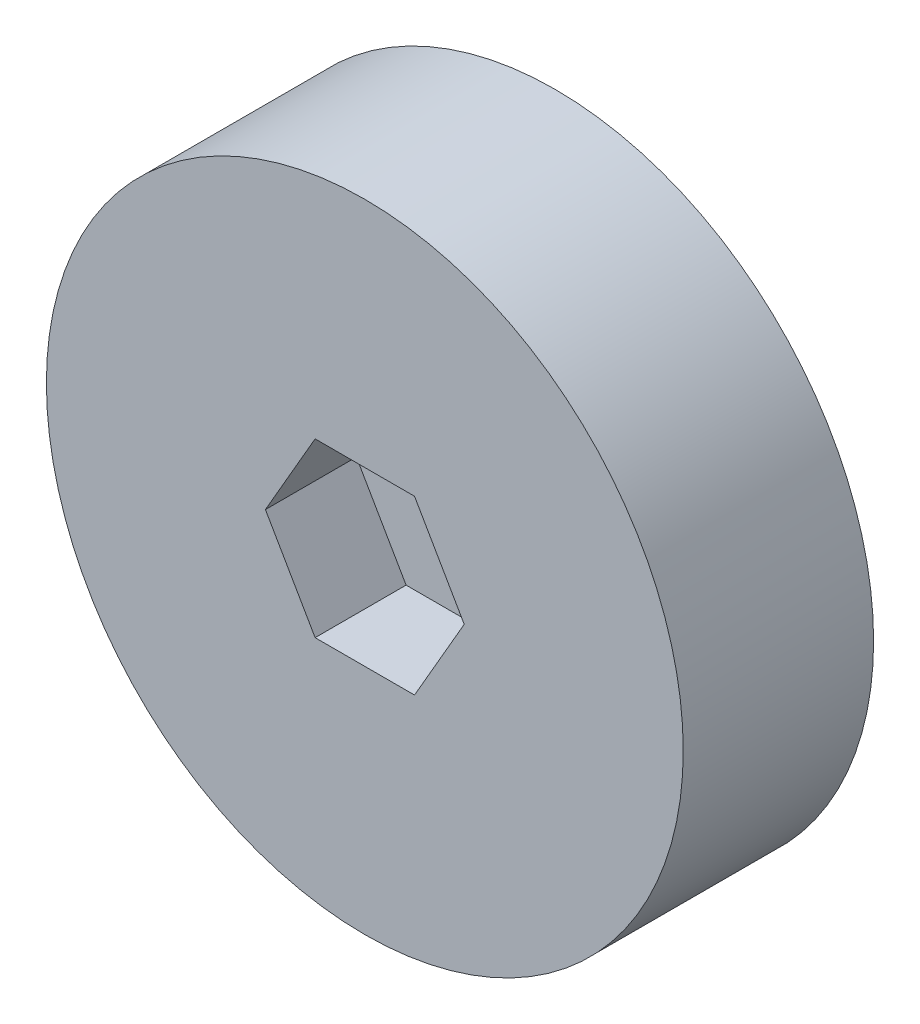
ISO-10303-21;
HEADER;
FILE_DESCRIPTION(('STEP AP214'),'2;1');
FILE_NAME('part.step','',(''),(''),'','','');
FILE_SCHEMA(('AUTOMOTIVE_DESIGN { 1 0 10303 214 1 1 1 1 }'));
ENDSEC;
DATA;
#1=APPLICATION_CONTEXT('core data for automotive mechanical design processes');
#2=APPLICATION_PROTOCOL_DEFINITION('international standard','automotive_design',2000,#1);
#3=PRODUCT_CONTEXT('',#1,'mechanical');
#4=PRODUCT('Part','Part','',(#3));
#5=PRODUCT_RELATED_PRODUCT_CATEGORY('part','',(#4));
#6=PRODUCT_DEFINITION_FORMATION('','',#4);
#7=PRODUCT_DEFINITION_CONTEXT('part definition',#1,'design');
#8=PRODUCT_DEFINITION('design','',#6,#7);
#9=PRODUCT_DEFINITION_SHAPE('','',#8);
#10=(LENGTH_UNIT() NAMED_UNIT(*) SI_UNIT(.MILLI.,.METRE.));
#11=(NAMED_UNIT(*) PLANE_ANGLE_UNIT() SI_UNIT($,.RADIAN.));
#12=(NAMED_UNIT(*) SI_UNIT($,.STERADIAN.) SOLID_ANGLE_UNIT());
#13=UNCERTAINTY_MEASURE_WITH_UNIT(LENGTH_MEASURE(1.E-05),#10,'distance_accuracy_value','');
#14=(GEOMETRIC_REPRESENTATION_CONTEXT(3) GLOBAL_UNCERTAINTY_ASSIGNED_CONTEXT((#13)) GLOBAL_UNIT_ASSIGNED_CONTEXT((#10,
#11,#12)) REPRESENTATION_CONTEXT('',''));
#15=CARTESIAN_POINT('',(0.,0.,0.));
#16=DIRECTION('',(0.,0.,1.));
#17=DIRECTION('',(1.,0.,0.));
#18=AXIS2_PLACEMENT_3D('',#15,#16,#17);
#19=CARTESIAN_POINT('',(0.,0.,-7.1));
#20=DIRECTION('',(0.,0.,-1.));
#21=DIRECTION('',(-1.,0.,0.));
#22=AXIS2_PLACEMENT_3D('',#19,#20,#21);
#23=PLANE('',#22);
#24=CARTESIAN_POINT('',(0.,0.,-7.1));
#25=DIRECTION('',(0.,0.,-1.));
#26=DIRECTION('',(-1.,0.,0.));
#27=AXIS2_PLACEMENT_3D('',#24,#25,#26);
#28=CIRCLE('',#27,22.75);
#29=CARTESIAN_POINT('',(-22.75,0.,-7.1));
#30=VERTEX_POINT('',#29);
#31=EDGE_CURVE('E132',#30,#30,#28,.T.);
#32=ORIENTED_EDGE('',*,*,#31,.T.);
#33=EDGE_LOOP('',(#32));
#34=FACE_BOUND('',#33,.T.);
#35=CARTESIAN_POINT('',(0.,0.,-7.1));
#36=DIRECTION('',(0.,0.,-1.));
#37=DIRECTION('',(-1.,0.,0.));
#38=AXIS2_PLACEMENT_3D('',#35,#36,#37);
#39=CIRCLE('',#38,4.);
#40=CARTESIAN_POINT('',(-4.,0.,-7.1));
#41=VERTEX_POINT('',#40);
#42=EDGE_CURVE('E161',#41,#41,#39,.T.);
#43=ORIENTED_EDGE('',*,*,#42,.F.);
#44=EDGE_LOOP('',(#43));
#45=FACE_BOUND('',#44,.T.);
#46=ADVANCED_FACE('F39',(#34,#45),#23,.T.);
#47=CARTESIAN_POINT('',(0.,0.,6.5));
#48=DIRECTION('',(0.,0.,1.));
#49=DIRECTION('',(1.,0.,0.));
#50=AXIS2_PLACEMENT_3D('',#47,#48,#49);
#51=PLANE('',#50);
#52=CARTESIAN_POINT('',(0.,0.,6.5));
#53=DIRECTION('',(0.,0.,1.));
#54=DIRECTION('',(1.,0.,0.));
#55=AXIS2_PLACEMENT_3D('',#52,#53,#54);
#56=CIRCLE('',#55,22.75);
#57=CARTESIAN_POINT('',(-22.75,0.,6.5));
#58=VERTEX_POINT('',#57);
#59=EDGE_CURVE('E11',#58,#58,#56,.T.);
#60=ORIENTED_EDGE('',*,*,#59,.T.);
#61=EDGE_LOOP('',(#60));
#62=FACE_BOUND('',#61,.T.);
#63=DIRECTION('',(-0.5,0.866025403784439,0.));
#64=VECTOR('',#63,1.);
#65=CARTESIAN_POINT('',(7.1014083110324,0.,6.5));
#66=LINE('',#65,#64);
#67=CARTESIAN_POINT('',(7.1014083110324,0.,6.5));
#68=VERTEX_POINT('',#67);
#69=CARTESIAN_POINT('',(3.5507041555162,6.15,6.5));
#70=VERTEX_POINT('',#69);
#71=EDGE_CURVE('E109',#68,#70,#66,.T.);
#72=ORIENTED_EDGE('',*,*,#71,.F.);
#73=DIRECTION('',(0.5,0.866025403784439,0.));
#74=VECTOR('',#73,1.);
#75=CARTESIAN_POINT('',(3.5507041555162,-6.15,6.5));
#76=LINE('',#75,#74);
#77=CARTESIAN_POINT('',(3.5507041555162,-6.15,6.5));
#78=VERTEX_POINT('',#77);
#79=EDGE_CURVE('E89',#78,#68,#76,.T.);
#80=ORIENTED_EDGE('',*,*,#79,.F.);
#81=DIRECTION('',(1.,0.,0.));
#82=VECTOR('',#81,1.);
#83=CARTESIAN_POINT('',(-3.5507041555162,-6.15,6.5));
#84=LINE('',#83,#82);
#85=CARTESIAN_POINT('',(-3.5507041555162,-6.15,6.5));
#86=VERTEX_POINT('',#85);
#87=EDGE_CURVE('E60',#86,#78,#84,.T.);
#88=ORIENTED_EDGE('',*,*,#87,.F.);
#89=DIRECTION('',(0.5,-0.866025403784439,0.));
#90=VECTOR('',#89,1.);
#91=CARTESIAN_POINT('',(-7.1014083110324,0.,6.5));
#92=LINE('',#91,#90);
#93=CARTESIAN_POINT('',(-7.1014083110324,0.,6.5));
#94=VERTEX_POINT('',#93);
#95=EDGE_CURVE('E121',#94,#86,#92,.T.);
#96=ORIENTED_EDGE('',*,*,#95,.F.);
#97=DIRECTION('',(-0.5,-0.866025403784439,0.));
#98=VECTOR('',#97,1.);
#99=CARTESIAN_POINT('',(-3.5507041555162,6.15,6.5));
#100=LINE('',#99,#98);
#101=CARTESIAN_POINT('',(-3.5507041555162,6.15,6.5));
#102=VERTEX_POINT('',#101);
#103=EDGE_CURVE('E108',#102,#94,#100,.T.);
#104=ORIENTED_EDGE('',*,*,#103,.F.);
#105=DIRECTION('',(-1.,0.,0.));
#106=VECTOR('',#105,1.);
#107=CARTESIAN_POINT('',(3.5507041555162,6.15,6.5));
#108=LINE('',#107,#106);
#109=EDGE_CURVE('E98',#70,#102,#108,.T.);
#110=ORIENTED_EDGE('',*,*,#109,.F.);
#111=EDGE_LOOP('',(#72,#80,#88,#96,#104,#110));
#112=FACE_BOUND('',#111,.T.);
#113=ADVANCED_FACE('F120',(#62,#112),#51,.T.);
#114=CARTESIAN_POINT('',(0.,0.,6.5));
#115=DIRECTION('',(0.,0.,-1.));
#116=DIRECTION('',(-1.,0.,0.));
#117=AXIS2_PLACEMENT_3D('',#114,#115,#116);
#118=CYLINDRICAL_SURFACE('',#117,22.75);
#119=CARTESIAN_POINT('',(-22.75,0.,6.5));
#120=CARTESIAN_POINT('',(-22.75,0.,6.35833333333333));
#121=CARTESIAN_POINT('',(-22.75,0.,6.21666666666667));
#122=CARTESIAN_POINT('',(-22.75,0.,5.93333333333333));
#123=CARTESIAN_POINT('',(-22.75,0.,5.79166666666667));
#124=CARTESIAN_POINT('',(-22.75,0.,5.50833333333333));
#125=CARTESIAN_POINT('',(-22.75,0.,5.36666666666667));
#126=CARTESIAN_POINT('',(-22.75,0.,5.08333333333333));
#127=CARTESIAN_POINT('',(-22.75,0.,4.94166666666667));
#128=CARTESIAN_POINT('',(-22.75,0.,4.65833333333333));
#129=CARTESIAN_POINT('',(-22.75,0.,4.51666666666667));
#130=CARTESIAN_POINT('',(-22.75,0.,4.23333333333333));
#131=CARTESIAN_POINT('',(-22.75,0.,4.09166666666667));
#132=CARTESIAN_POINT('',(-22.75,0.,3.80833333333333));
#133=CARTESIAN_POINT('',(-22.75,0.,3.66666666666667));
#134=CARTESIAN_POINT('',(-22.75,0.,3.38333333333333));
#135=CARTESIAN_POINT('',(-22.75,0.,3.24166666666667));
#136=CARTESIAN_POINT('',(-22.75,0.,2.95833333333333));
#137=CARTESIAN_POINT('',(-22.75,0.,2.81666666666667));
#138=CARTESIAN_POINT('',(-22.75,0.,2.53333333333333));
#139=CARTESIAN_POINT('',(-22.75,0.,2.39166666666667));
#140=CARTESIAN_POINT('',(-22.75,0.,2.10833333333333));
#141=CARTESIAN_POINT('',(-22.75,0.,1.96666666666667));
#142=CARTESIAN_POINT('',(-22.75,0.,1.68333333333333));
#143=CARTESIAN_POINT('',(-22.75,0.,1.54166666666667));
#144=CARTESIAN_POINT('',(-22.75,0.,1.25833333333333));
#145=CARTESIAN_POINT('',(-22.75,0.,1.11666666666667));
#146=CARTESIAN_POINT('',(-22.75,0.,0.833333333333333));
#147=CARTESIAN_POINT('',(-22.75,0.,0.691666666666666));
#148=CARTESIAN_POINT('',(-22.75,0.,0.408333333333333));
#149=CARTESIAN_POINT('',(-22.75,0.,0.266666666666666));
#150=CARTESIAN_POINT('',(-22.75,0.,-0.0166666666666674));
#151=CARTESIAN_POINT('',(-22.75,0.,-0.158333333333334));
#152=CARTESIAN_POINT('',(-22.75,0.,-0.441666666666667));
#153=CARTESIAN_POINT('',(-22.75,0.,-0.583333333333334));
#154=CARTESIAN_POINT('',(-22.75,0.,-0.866666666666667));
#155=CARTESIAN_POINT('',(-22.75,0.,-1.00833333333333));
#156=CARTESIAN_POINT('',(-22.75,0.,-1.29166666666667));
#157=CARTESIAN_POINT('',(-22.75,0.,-1.43333333333333));
#158=CARTESIAN_POINT('',(-22.75,0.,-1.71666666666667));
#159=CARTESIAN_POINT('',(-22.75,0.,-1.85833333333333));
#160=CARTESIAN_POINT('',(-22.75,0.,-2.14166666666667));
#161=CARTESIAN_POINT('',(-22.75,0.,-2.28333333333333));
#162=CARTESIAN_POINT('',(-22.75,0.,-2.56666666666667));
#163=CARTESIAN_POINT('',(-22.75,0.,-2.70833333333333));
#164=CARTESIAN_POINT('',(-22.75,0.,-2.99166666666667));
#165=CARTESIAN_POINT('',(-22.75,0.,-3.13333333333333));
#166=CARTESIAN_POINT('',(-22.75,0.,-3.41666666666667));
#167=CARTESIAN_POINT('',(-22.75,0.,-3.55833333333333));
#168=CARTESIAN_POINT('',(-22.75,0.,-3.84166666666667));
#169=CARTESIAN_POINT('',(-22.75,0.,-3.98333333333333));
#170=CARTESIAN_POINT('',(-22.75,0.,-4.26666666666667));
#171=CARTESIAN_POINT('',(-22.75,0.,-4.40833333333333));
#172=CARTESIAN_POINT('',(-22.75,0.,-4.69166666666667));
#173=CARTESIAN_POINT('',(-22.75,0.,-4.83333333333333));
#174=CARTESIAN_POINT('',(-22.75,0.,-5.11666666666667));
#175=CARTESIAN_POINT('',(-22.75,0.,-5.25833333333333));
#176=CARTESIAN_POINT('',(-22.75,0.,-5.54166666666667));
#177=CARTESIAN_POINT('',(-22.75,0.,-5.68333333333333));
#178=CARTESIAN_POINT('',(-22.75,0.,-5.96666666666667));
#179=CARTESIAN_POINT('',(-22.75,0.,-6.10833333333333));
#180=CARTESIAN_POINT('',(-22.75,0.,-6.39166666666667));
#181=CARTESIAN_POINT('',(-22.75,0.,-6.53333333333333));
#182=CARTESIAN_POINT('',(-22.75,0.,-6.81666666666667));
#183=CARTESIAN_POINT('',(-22.75,0.,-6.95833333333333));
#184=CARTESIAN_POINT('',(-22.75,0.,-7.1));
#185=B_SPLINE_CURVE_WITH_KNOTS('',3,(#119,#120,#121,#122,#123,#124,#125,#126,#127,#128,#129,
#130,#131,#132,#133,#134,#135,#136,#137,#138,#139,#140,#141,#142,#143,#144,#145,#146,#147,#148,
#149,#150,#151,#152,#153,#154,#155,#156,#157,#158,#159,#160,#161,#162,#163,#164,#165,#166,#167,
#168,#169,#170,#171,#172,#173,#174,#175,#176,#177,#178,#179,#180,#181,#182,#183,#184),
.UNSPECIFIED.,.F.,.F.,(4,2,2,2,2,2,2,2,2,2,2,2,2,2,2,2,2,2,2,2,2,2,2,2,2,2,2,2,2,2,2,2,4),(0.,
0.424999999999999,0.849999999999999,1.275,1.7,2.125,2.55,2.975,3.4,3.825,4.25,4.675,5.1,5.525,
5.95,6.375,6.8,7.225,7.65,8.075,8.5,8.925,9.35,9.775,10.2,10.625,11.05,11.475,11.9,12.325,12.75,
13.175,13.6),.UNSPECIFIED.);
#186=EDGE_CURVE('BSEAM41',#58,#30,#185,.T.);
#187=ORIENTED_EDGE('',*,*,#59,.F.);
#188=ORIENTED_EDGE('',*,*,#31,.F.);
#189=ORIENTED_EDGE('',*,*,#186,.T.);
#190=ORIENTED_EDGE('',*,*,#186,.F.);
#191=EDGE_LOOP('',(#187,#189,#188,#190));
#192=FACE_BOUND('',#191,.T.);
#193=ADVANCED_FACE('F41',(#192),#118,.T.);
#194=CARTESIAN_POINT('',(3.5507041555162,-6.15,6.5));
#195=DIRECTION('',(-0.866025403784438,0.5,0.));
#196=DIRECTION('',(-0.5,-0.866025403784439,0.));
#197=AXIS2_PLACEMENT_3D('',#194,#195,#196);
#198=PLANE('',#197);
#199=DIRECTION('',(0.5,0.866025403784439,0.));
#200=VECTOR('',#199,1.);
#201=CARTESIAN_POINT('',(3.5507041555162,-6.15,0.));
#202=LINE('',#201,#200);
#203=CARTESIAN_POINT('',(3.5507041555162,-6.15,0.));
#204=VERTEX_POINT('',#203);
#205=CARTESIAN_POINT('',(7.1014083110324,0.,0.));
#206=VERTEX_POINT('',#205);
#207=EDGE_CURVE('E128',#204,#206,#202,.T.);
#208=ORIENTED_EDGE('',*,*,#207,.F.);
#209=DIRECTION('',(0.,0.,-1.));
#210=VECTOR('',#209,1.);
#211=CARTESIAN_POINT('',(3.5507041555162,-6.15,6.5));
#212=LINE('',#211,#210);
#213=EDGE_CURVE('E127',#78,#204,#212,.T.);
#214=ORIENTED_EDGE('',*,*,#213,.F.);
#215=ORIENTED_EDGE('',*,*,#79,.T.);
#216=DIRECTION('',(0.,0.,-1.));
#217=VECTOR('',#216,1.);
#218=CARTESIAN_POINT('',(7.1014083110324,0.,6.5));
#219=LINE('',#218,#217);
#220=EDGE_CURVE('E47',#68,#206,#219,.T.);
#221=ORIENTED_EDGE('',*,*,#220,.T.);
#222=EDGE_LOOP('',(#208,#214,#215,#221));
#223=FACE_BOUND('',#222,.T.);
#224=ADVANCED_FACE('F148',(#223),#198,.T.);
#225=CARTESIAN_POINT('',(7.1014083110324,0.,6.5));
#226=DIRECTION('',(-0.866025403784438,-0.5,0.));
#227=DIRECTION('',(0.5,-0.866025403784438,0.));
#228=AXIS2_PLACEMENT_3D('',#225,#226,#227);
#229=PLANE('',#228);
#230=DIRECTION('',(-0.5,0.866025403784439,0.));
#231=VECTOR('',#230,1.);
#232=CARTESIAN_POINT('',(7.1014083110324,0.,0.));
#233=LINE('',#232,#231);
#234=CARTESIAN_POINT('',(3.5507041555162,6.15,0.));
#235=VERTEX_POINT('',#234);
#236=EDGE_CURVE('E131',#206,#235,#233,.T.);
#237=ORIENTED_EDGE('',*,*,#236,.F.);
#238=ORIENTED_EDGE('',*,*,#220,.F.);
#239=ORIENTED_EDGE('',*,*,#71,.T.);
#240=DIRECTION('',(0.,0.,-1.));
#241=VECTOR('',#240,1.);
#242=CARTESIAN_POINT('',(3.5507041555162,6.15,6.5));
#243=LINE('',#242,#241);
#244=EDGE_CURVE('E104',#70,#235,#243,.T.);
#245=ORIENTED_EDGE('',*,*,#244,.T.);
#246=EDGE_LOOP('',(#237,#238,#239,#245));
#247=FACE_BOUND('',#246,.T.);
#248=ADVANCED_FACE('F206',(#247),#229,.T.);
#249=CARTESIAN_POINT('',(3.5507041555162,6.15,6.5));
#250=DIRECTION('',(0.,-1.,0.));
#251=DIRECTION('',(1.,0.,0.));
#252=AXIS2_PLACEMENT_3D('',#249,#250,#251);
#253=PLANE('',#252);
#254=DIRECTION('',(-1.,0.,0.));
#255=VECTOR('',#254,1.);
#256=CARTESIAN_POINT('',(3.5507041555162,6.15,0.));
#257=LINE('',#256,#255);
#258=CARTESIAN_POINT('',(-3.5507041555162,6.15,0.));
#259=VERTEX_POINT('',#258);
#260=EDGE_CURVE('E135',#235,#259,#257,.T.);
#261=ORIENTED_EDGE('',*,*,#260,.F.);
#262=ORIENTED_EDGE('',*,*,#244,.F.);
#263=ORIENTED_EDGE('',*,*,#109,.T.);
#264=DIRECTION('',(0.,0.,-1.));
#265=VECTOR('',#264,1.);
#266=CARTESIAN_POINT('',(-3.5507041555162,6.15,6.5));
#267=LINE('',#266,#265);
#268=EDGE_CURVE('E102',#102,#259,#267,.T.);
#269=ORIENTED_EDGE('',*,*,#268,.T.);
#270=EDGE_LOOP('',(#261,#262,#263,#269));
#271=FACE_BOUND('',#270,.T.);
#272=ADVANCED_FACE('F101',(#271),#253,.T.);
#273=CARTESIAN_POINT('',(-3.5507041555162,6.15,6.5));
#274=DIRECTION('',(0.866025403784439,-0.5,0.));
#275=DIRECTION('',(0.5,0.866025403784439,0.));
#276=AXIS2_PLACEMENT_3D('',#273,#274,#275);
#277=PLANE('',#276);
#278=DIRECTION('',(-0.5,-0.866025403784439,0.));
#279=VECTOR('',#278,1.);
#280=CARTESIAN_POINT('',(-3.5507041555162,6.15,0.));
#281=LINE('',#280,#279);
#282=CARTESIAN_POINT('',(-7.1014083110324,0.,0.));
#283=VERTEX_POINT('',#282);
#284=EDGE_CURVE('E115',#259,#283,#281,.T.);
#285=ORIENTED_EDGE('',*,*,#284,.F.);
#286=ORIENTED_EDGE('',*,*,#268,.F.);
#287=ORIENTED_EDGE('',*,*,#103,.T.);
#288=DIRECTION('',(0.,0.,-1.));
#289=VECTOR('',#288,1.);
#290=CARTESIAN_POINT('',(-7.1014083110324,0.,6.5));
#291=LINE('',#290,#289);
#292=EDGE_CURVE('E117',#94,#283,#291,.T.);
#293=ORIENTED_EDGE('',*,*,#292,.T.);
#294=EDGE_LOOP('',(#285,#286,#287,#293));
#295=FACE_BOUND('',#294,.T.);
#296=ADVANCED_FACE('F112',(#295),#277,.T.);
#297=CARTESIAN_POINT('',(-7.1014083110324,0.,6.5));
#298=DIRECTION('',(0.866025403784439,0.5,0.));
#299=DIRECTION('',(-0.5,0.866025403784439,0.));
#300=AXIS2_PLACEMENT_3D('',#297,#298,#299);
#301=PLANE('',#300);
#302=DIRECTION('',(0.5,-0.866025403784439,0.));
#303=VECTOR('',#302,1.);
#304=CARTESIAN_POINT('',(-7.1014083110324,0.,0.));
#305=LINE('',#304,#303);
#306=CARTESIAN_POINT('',(-3.5507041555162,-6.15,0.));
#307=VERTEX_POINT('',#306);
#308=EDGE_CURVE('E138',#283,#307,#305,.T.);
#309=ORIENTED_EDGE('',*,*,#308,.F.);
#310=ORIENTED_EDGE('',*,*,#292,.F.);
#311=ORIENTED_EDGE('',*,*,#95,.T.);
#312=DIRECTION('',(0.,0.,-1.));
#313=VECTOR('',#312,1.);
#314=CARTESIAN_POINT('',(-3.5507041555162,-6.15,6.5));
#315=LINE('',#314,#313);
#316=EDGE_CURVE('E54',#86,#307,#315,.T.);
#317=ORIENTED_EDGE('',*,*,#316,.T.);
#318=EDGE_LOOP('',(#309,#310,#311,#317));
#319=FACE_BOUND('',#318,.T.);
#320=ADVANCED_FACE('F199',(#319),#301,.T.);
#321=CARTESIAN_POINT('',(-3.5507041555162,-6.15,6.5));
#322=DIRECTION('',(0.,1.,0.));
#323=DIRECTION('',(0.,0.,1.));
#324=AXIS2_PLACEMENT_3D('',#321,#322,#323);
#325=PLANE('',#324);
#326=DIRECTION('',(1.,0.,0.));
#327=VECTOR('',#326,1.);
#328=CARTESIAN_POINT('',(-3.5507041555162,-6.15,0.));
#329=LINE('',#328,#327);
#330=EDGE_CURVE('E141',#307,#204,#329,.T.);
#331=ORIENTED_EDGE('',*,*,#330,.F.);
#332=ORIENTED_EDGE('',*,*,#316,.F.);
#333=ORIENTED_EDGE('',*,*,#87,.T.);
#334=ORIENTED_EDGE('',*,*,#213,.T.);
#335=EDGE_LOOP('',(#331,#332,#333,#334));
#336=FACE_BOUND('',#335,.T.);
#337=ADVANCED_FACE('F152',(#336),#325,.T.);
#338=CARTESIAN_POINT('',(0.,0.,0.));
#339=DIRECTION('',(0.,0.,-1.));
#340=DIRECTION('',(-1.,0.,0.));
#341=AXIS2_PLACEMENT_3D('',#338,#339,#340);
#342=PLANE('',#341);
#343=CARTESIAN_POINT('',(0.,0.,0.));
#344=DIRECTION('',(0.,0.,-1.));
#345=DIRECTION('',(-1.,0.,0.));
#346=AXIS2_PLACEMENT_3D('',#343,#344,#345);
#347=CIRCLE('',#346,2.25);
#348=CARTESIAN_POINT('',(-2.25,0.,0.));
#349=VERTEX_POINT('',#348);
#350=EDGE_CURVE('E157',#349,#349,#347,.T.);
#351=ORIENTED_EDGE('',*,*,#350,.T.);
#352=EDGE_LOOP('',(#351));
#353=FACE_BOUND('',#352,.T.);
#354=ORIENTED_EDGE('',*,*,#330,.T.);
#355=ORIENTED_EDGE('',*,*,#207,.T.);
#356=ORIENTED_EDGE('',*,*,#236,.T.);
#357=ORIENTED_EDGE('',*,*,#260,.T.);
#358=ORIENTED_EDGE('',*,*,#284,.T.);
#359=ORIENTED_EDGE('',*,*,#308,.T.);
#360=EDGE_LOOP('',(#354,#355,#356,#357,#358,#359));
#361=FACE_BOUND('',#360,.T.);
#362=ADVANCED_FACE('F151',(#353,#361),#342,.F.);
#363=CARTESIAN_POINT('',(0.,0.,-7.1));
#364=DIRECTION('',(0.,0.,1.));
#365=DIRECTION('',(1.,0.,0.));
#366=AXIS2_PLACEMENT_3D('',#363,#364,#365);
#367=CYLINDRICAL_SURFACE('',#366,2.25);
#368=ORIENTED_EDGE('',*,*,#350,.F.);
#369=EDGE_LOOP('',(#368));
#370=FACE_BOUND('',#369,.T.);
#371=CARTESIAN_POINT('',(0.,0.,-14.1));
#372=DIRECTION('',(0.,0.,-1.));
#373=DIRECTION('',(-1.,0.,0.));
#374=AXIS2_PLACEMENT_3D('',#371,#372,#373);
#375=CIRCLE('',#374,2.25);
#376=CARTESIAN_POINT('',(-2.25,0.,-14.1));
#377=VERTEX_POINT('',#376);
#378=EDGE_CURVE('E164',#377,#377,#375,.T.);
#379=ORIENTED_EDGE('',*,*,#378,.T.);
#380=EDGE_LOOP('',(#379));
#381=FACE_BOUND('',#380,.T.);
#382=ADVANCED_FACE('F170',(#370,#381),#367,.F.);
#383=CARTESIAN_POINT('',(0.,0.,-14.1));
#384=DIRECTION('',(0.,0.,-1.));
#385=DIRECTION('',(-1.,0.,0.));
#386=AXIS2_PLACEMENT_3D('',#383,#384,#385);
#387=PLANE('',#386);
#388=CARTESIAN_POINT('',(0.,0.,-14.1));
#389=DIRECTION('',(0.,0.,-1.));
#390=DIRECTION('',(-1.,0.,0.));
#391=AXIS2_PLACEMENT_3D('',#388,#389,#390);
#392=CIRCLE('',#391,4.);
#393=CARTESIAN_POINT('',(-4.,0.,-14.1));
#394=VERTEX_POINT('',#393);
#395=EDGE_CURVE('E160',#394,#394,#392,.T.);
#396=ORIENTED_EDGE('',*,*,#395,.T.);
#397=EDGE_LOOP('',(#396));
#398=FACE_BOUND('',#397,.T.);
#399=ORIENTED_EDGE('',*,*,#378,.F.);
#400=EDGE_LOOP('',(#399));
#401=FACE_BOUND('',#400,.T.);
#402=ADVANCED_FACE('F172',(#398,#401),#387,.T.);
#403=CARTESIAN_POINT('',(0.,0.,-14.1));
#404=DIRECTION('',(0.,0.,1.));
#405=DIRECTION('',(1.,0.,0.));
#406=AXIS2_PLACEMENT_3D('',#403,#404,#405);
#407=CYLINDRICAL_SURFACE('',#406,4.);
#408=ORIENTED_EDGE('',*,*,#395,.F.);
#409=EDGE_LOOP('',(#408));
#410=FACE_BOUND('',#409,.T.);
#411=ORIENTED_EDGE('',*,*,#42,.T.);
#412=EDGE_LOOP('',(#411));
#413=FACE_BOUND('',#412,.T.);
#414=ADVANCED_FACE('F174',(#410,#413),#407,.T.);
#415=CLOSED_SHELL('',(#46,#113,#193,#224,#248,#272,#296,#320,#337,#362,#382,#402,#414));
#416=MANIFOLD_SOLID_BREP('B2',#415);
#417=ADVANCED_BREP_SHAPE_REPRESENTATION('',(#18,#416),#14);
#418=SHAPE_DEFINITION_REPRESENTATION(#9,#417);
ENDSEC;
END-ISO-10303-21;
